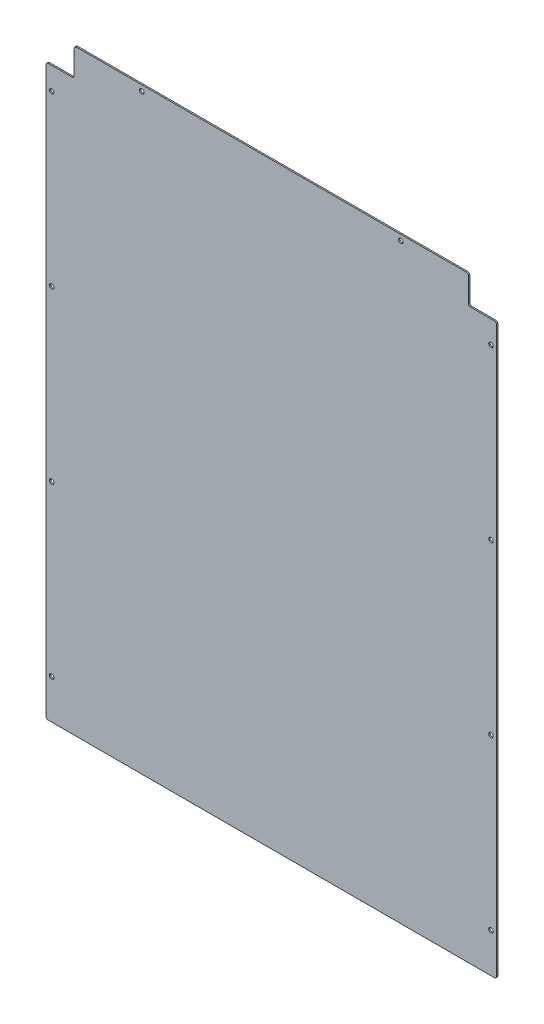
ISO-10303-21;
HEADER;
FILE_DESCRIPTION(('STEP AP214'),'2;1');
FILE_NAME('part.step','',(''),(''),'','','');
FILE_SCHEMA(('AUTOMOTIVE_DESIGN { 1 0 10303 214 1 1 1 1 }'));
ENDSEC;
DATA;
#1=APPLICATION_CONTEXT('core data for automotive mechanical design processes');
#2=APPLICATION_PROTOCOL_DEFINITION('international standard','automotive_design',2000,#1);
#3=PRODUCT_CONTEXT('',#1,'mechanical');
#4=PRODUCT('Part','Part','',(#3));
#5=PRODUCT_RELATED_PRODUCT_CATEGORY('part','',(#4));
#6=PRODUCT_DEFINITION_FORMATION('','',#4);
#7=PRODUCT_DEFINITION_CONTEXT('part definition',#1,'design');
#8=PRODUCT_DEFINITION('design','',#6,#7);
#9=PRODUCT_DEFINITION_SHAPE('','',#8);
#10=(LENGTH_UNIT() NAMED_UNIT(*) SI_UNIT(.MILLI.,.METRE.));
#11=(NAMED_UNIT(*) PLANE_ANGLE_UNIT() SI_UNIT($,.RADIAN.));
#12=(NAMED_UNIT(*) SI_UNIT($,.STERADIAN.) SOLID_ANGLE_UNIT());
#13=UNCERTAINTY_MEASURE_WITH_UNIT(LENGTH_MEASURE(1.E-05),#10,'distance_accuracy_value','');
#14=(GEOMETRIC_REPRESENTATION_CONTEXT(3) GLOBAL_UNCERTAINTY_ASSIGNED_CONTEXT((#13)) GLOBAL_UNIT_ASSIGNED_CONTEXT((#10,
#11,#12)) REPRESENTATION_CONTEXT('',''));
#15=CARTESIAN_POINT('',(0.,0.,0.));
#16=DIRECTION('',(0.,0.,1.));
#17=DIRECTION('',(1.,0.,0.));
#18=AXIS2_PLACEMENT_3D('',#15,#16,#17);
#19=CARTESIAN_POINT('',(-200.,0.,-1.2));
#20=DIRECTION('',(-1.,0.,0.));
#21=DIRECTION('',(0.,0.,1.));
#22=AXIS2_PLACEMENT_3D('',#19,#20,#21);
#23=PLANE('',#22);
#24=DIRECTION('',(0.,-1.,0.));
#25=VECTOR('',#24,1.);
#26=CARTESIAN_POINT('',(-200.,0.,-1.2));
#27=LINE('',#26,#25);
#28=CARTESIAN_POINT('',(-200.,503.,-1.2));
#29=VERTEX_POINT('',#28);
#30=CARTESIAN_POINT('',(-200.,2.,-1.2));
#31=VERTEX_POINT('',#30);
#32=EDGE_CURVE('E286',#29,#31,#27,.T.);
#33=ORIENTED_EDGE('',*,*,#32,.T.);
#34=DIRECTION('',(0.,0.,1.));
#35=VECTOR('',#34,1.);
#36=CARTESIAN_POINT('',(-200.,2.,-1.2));
#37=LINE('',#36,#35);
#38=CARTESIAN_POINT('',(-200.,2.,0.));
#39=VERTEX_POINT('',#38);
#40=EDGE_CURVE('E215',#31,#39,#37,.T.);
#41=ORIENTED_EDGE('',*,*,#40,.T.);
#42=DIRECTION('',(0.,-1.,0.));
#43=VECTOR('',#42,1.);
#44=CARTESIAN_POINT('',(-200.,0.,0.));
#45=LINE('',#44,#43);
#46=CARTESIAN_POINT('',(-200.,503.,0.));
#47=VERTEX_POINT('',#46);
#48=EDGE_CURVE('E158',#47,#39,#45,.T.);
#49=ORIENTED_EDGE('',*,*,#48,.F.);
#50=DIRECTION('',(0.,0.,1.));
#51=VECTOR('',#50,1.);
#52=CARTESIAN_POINT('',(-200.,503.,-1.2));
#53=LINE('',#52,#51);
#54=EDGE_CURVE('E213',#47,#29,#53,.F.);
#55=ORIENTED_EDGE('',*,*,#54,.T.);
#56=EDGE_LOOP('',(#33,#41,#49,#55));
#57=FACE_BOUND('',#56,.T.);
#58=ADVANCED_FACE('F40',(#57),#23,.T.);
#59=CARTESIAN_POINT('',(-200.,505.,-1.2));
#60=DIRECTION('',(0.,1.,0.));
#61=DIRECTION('',(0.,0.,1.));
#62=AXIS2_PLACEMENT_3D('',#59,#60,#61);
#63=PLANE('',#62);
#64=DIRECTION('',(-1.,0.,0.));
#65=VECTOR('',#64,1.);
#66=CARTESIAN_POINT('',(-200.,505.,-1.2));
#67=LINE('',#66,#65);
#68=CARTESIAN_POINT('',(-177.,505.,-1.2));
#69=VERTEX_POINT('',#68);
#70=CARTESIAN_POINT('',(-198.,505.,-1.2));
#71=VERTEX_POINT('',#70);
#72=EDGE_CURVE('E179',#69,#71,#67,.T.);
#73=ORIENTED_EDGE('',*,*,#72,.T.);
#74=DIRECTION('',(0.,0.,1.));
#75=VECTOR('',#74,1.);
#76=CARTESIAN_POINT('',(-198.,505.,-1.2));
#77=LINE('',#76,#75);
#78=CARTESIAN_POINT('',(-198.,505.,0.));
#79=VERTEX_POINT('',#78);
#80=EDGE_CURVE('E219',#71,#79,#77,.T.);
#81=ORIENTED_EDGE('',*,*,#80,.T.);
#82=DIRECTION('',(-1.,0.,0.));
#83=VECTOR('',#82,1.);
#84=CARTESIAN_POINT('',(-200.,505.,0.));
#85=LINE('',#84,#83);
#86=CARTESIAN_POINT('',(-177.,505.,0.));
#87=VERTEX_POINT('',#86);
#88=EDGE_CURVE('E187',#87,#79,#85,.T.);
#89=ORIENTED_EDGE('',*,*,#88,.F.);
#90=DIRECTION('',(0.,0.,1.));
#91=VECTOR('',#90,1.);
#92=CARTESIAN_POINT('',(-177.,505.,-1.2));
#93=LINE('',#92,#91);
#94=EDGE_CURVE('E217',#87,#69,#93,.F.);
#95=ORIENTED_EDGE('',*,*,#94,.T.);
#96=EDGE_LOOP('',(#73,#81,#89,#95));
#97=FACE_BOUND('',#96,.T.);
#98=ADVANCED_FACE('F378',(#97),#63,.T.);
#99=CARTESIAN_POINT('',(-175.,530.,-1.2));
#100=DIRECTION('',(-1.,0.,0.));
#101=DIRECTION('',(0.,-1.,0.));
#102=AXIS2_PLACEMENT_3D('',#99,#100,#101);
#103=PLANE('',#102);
#104=DIRECTION('',(0.,-1.,0.));
#105=VECTOR('',#104,1.);
#106=CARTESIAN_POINT('',(-175.,530.,-1.2));
#107=LINE('',#106,#105);
#108=CARTESIAN_POINT('',(-175.,528.,-1.2));
#109=VERTEX_POINT('',#108);
#110=CARTESIAN_POINT('',(-175.,507.,-1.2));
#111=VERTEX_POINT('',#110);
#112=EDGE_CURVE('E184',#109,#111,#107,.T.);
#113=ORIENTED_EDGE('',*,*,#112,.T.);
#114=DIRECTION('',(0.,0.,1.));
#115=VECTOR('',#114,1.);
#116=CARTESIAN_POINT('',(-175.,507.,0.));
#117=LINE('',#116,#115);
#118=CARTESIAN_POINT('',(-175.,507.,0.));
#119=VERTEX_POINT('',#118);
#120=EDGE_CURVE('E224',#111,#119,#117,.T.);
#121=ORIENTED_EDGE('',*,*,#120,.T.);
#122=DIRECTION('',(0.,-1.,0.));
#123=VECTOR('',#122,1.);
#124=CARTESIAN_POINT('',(-175.,530.,0.));
#125=LINE('',#124,#123);
#126=CARTESIAN_POINT('',(-175.,528.,0.));
#127=VERTEX_POINT('',#126);
#128=EDGE_CURVE('E282',#127,#119,#125,.T.);
#129=ORIENTED_EDGE('',*,*,#128,.F.);
#130=DIRECTION('',(0.,0.,1.));
#131=VECTOR('',#130,1.);
#132=CARTESIAN_POINT('',(-175.,528.,-1.2));
#133=LINE('',#132,#131);
#134=EDGE_CURVE('E222',#127,#109,#133,.F.);
#135=ORIENTED_EDGE('',*,*,#134,.T.);
#136=EDGE_LOOP('',(#113,#121,#129,#135));
#137=FACE_BOUND('',#136,.T.);
#138=ADVANCED_FACE('F383',(#137),#103,.T.);
#139=CARTESIAN_POINT('',(-175.,530.,-1.2));
#140=DIRECTION('',(0.,1.,0.));
#141=DIRECTION('',(0.,0.,1.));
#142=AXIS2_PLACEMENT_3D('',#139,#140,#141);
#143=PLANE('',#142);
#144=DIRECTION('',(-1.,0.,0.));
#145=VECTOR('',#144,1.);
#146=CARTESIAN_POINT('',(-175.,530.,-1.2));
#147=LINE('',#146,#145);
#148=CARTESIAN_POINT('',(173.,530.,-1.2));
#149=VERTEX_POINT('',#148);
#150=CARTESIAN_POINT('',(-173.,530.,-1.2));
#151=VERTEX_POINT('',#150);
#152=EDGE_CURVE('E265',#149,#151,#147,.T.);
#153=ORIENTED_EDGE('',*,*,#152,.T.);
#154=DIRECTION('',(0.,0.,1.));
#155=VECTOR('',#154,1.);
#156=CARTESIAN_POINT('',(-173.,530.,-1.2));
#157=LINE('',#156,#155);
#158=CARTESIAN_POINT('',(-173.,530.,0.));
#159=VERTEX_POINT('',#158);
#160=EDGE_CURVE('E229',#151,#159,#157,.T.);
#161=ORIENTED_EDGE('',*,*,#160,.T.);
#162=DIRECTION('',(-1.,0.,0.));
#163=VECTOR('',#162,1.);
#164=CARTESIAN_POINT('',(-175.,530.,0.));
#165=LINE('',#164,#163);
#166=CARTESIAN_POINT('',(173.,530.,0.));
#167=VERTEX_POINT('',#166);
#168=EDGE_CURVE('E256',#167,#159,#165,.T.);
#169=ORIENTED_EDGE('',*,*,#168,.F.);
#170=DIRECTION('',(0.,0.,1.));
#171=VECTOR('',#170,1.);
#172=CARTESIAN_POINT('',(173.,530.,-1.2));
#173=LINE('',#172,#171);
#174=EDGE_CURVE('E227',#167,#149,#173,.F.);
#175=ORIENTED_EDGE('',*,*,#174,.T.);
#176=EDGE_LOOP('',(#153,#161,#169,#175));
#177=FACE_BOUND('',#176,.T.);
#178=ADVANCED_FACE('F618',(#177),#143,.T.);
#179=CARTESIAN_POINT('',(175.,530.,-1.2));
#180=DIRECTION('',(1.,0.,0.));
#181=DIRECTION('',(0.,1.,0.));
#182=AXIS2_PLACEMENT_3D('',#179,#180,#181);
#183=PLANE('',#182);
#184=DIRECTION('',(0.,1.,0.));
#185=VECTOR('',#184,1.);
#186=CARTESIAN_POINT('',(175.,530.,-1.2));
#187=LINE('',#186,#185);
#188=CARTESIAN_POINT('',(175.,507.,-1.2));
#189=VERTEX_POINT('',#188);
#190=CARTESIAN_POINT('',(175.,528.,-1.2));
#191=VERTEX_POINT('',#190);
#192=EDGE_CURVE('E262',#189,#191,#187,.T.);
#193=ORIENTED_EDGE('',*,*,#192,.T.);
#194=DIRECTION('',(0.,0.,1.));
#195=VECTOR('',#194,1.);
#196=CARTESIAN_POINT('',(175.,528.,-1.2));
#197=LINE('',#196,#195);
#198=CARTESIAN_POINT('',(175.,528.,0.));
#199=VERTEX_POINT('',#198);
#200=EDGE_CURVE('E234',#191,#199,#197,.T.);
#201=ORIENTED_EDGE('',*,*,#200,.T.);
#202=DIRECTION('',(0.,1.,0.));
#203=VECTOR('',#202,1.);
#204=CARTESIAN_POINT('',(175.,530.,0.));
#205=LINE('',#204,#203);
#206=CARTESIAN_POINT('',(175.,507.,0.));
#207=VERTEX_POINT('',#206);
#208=EDGE_CURVE('E247',#207,#199,#205,.T.);
#209=ORIENTED_EDGE('',*,*,#208,.F.);
#210=DIRECTION('',(0.,0.,1.));
#211=VECTOR('',#210,1.);
#212=CARTESIAN_POINT('',(175.,507.,-1.2));
#213=LINE('',#212,#211);
#214=EDGE_CURVE('E232',#207,#189,#213,.F.);
#215=ORIENTED_EDGE('',*,*,#214,.T.);
#216=EDGE_LOOP('',(#193,#201,#209,#215));
#217=FACE_BOUND('',#216,.T.);
#218=ADVANCED_FACE('F254',(#217),#183,.T.);
#219=CARTESIAN_POINT('',(200.,505.,-1.2));
#220=DIRECTION('',(0.,1.,0.));
#221=DIRECTION('',(0.,0.,1.));
#222=AXIS2_PLACEMENT_3D('',#219,#220,#221);
#223=PLANE('',#222);
#224=DIRECTION('',(-1.,0.,0.));
#225=VECTOR('',#224,1.);
#226=CARTESIAN_POINT('',(200.,505.,-1.2));
#227=LINE('',#226,#225);
#228=CARTESIAN_POINT('',(198.,505.,-1.2));
#229=VERTEX_POINT('',#228);
#230=CARTESIAN_POINT('',(177.,505.,-1.2));
#231=VERTEX_POINT('',#230);
#232=EDGE_CURVE('E260',#229,#231,#227,.T.);
#233=ORIENTED_EDGE('',*,*,#232,.T.);
#234=DIRECTION('',(0.,0.,1.));
#235=VECTOR('',#234,1.);
#236=CARTESIAN_POINT('',(177.,505.,0.));
#237=LINE('',#236,#235);
#238=CARTESIAN_POINT('',(177.,505.,0.));
#239=VERTEX_POINT('',#238);
#240=EDGE_CURVE('E238',#231,#239,#237,.T.);
#241=ORIENTED_EDGE('',*,*,#240,.T.);
#242=DIRECTION('',(-1.,0.,0.));
#243=VECTOR('',#242,1.);
#244=CARTESIAN_POINT('',(200.,505.,0.));
#245=LINE('',#244,#243);
#246=CARTESIAN_POINT('',(198.,505.,0.));
#247=VERTEX_POINT('',#246);
#248=EDGE_CURVE('E248',#247,#239,#245,.T.);
#249=ORIENTED_EDGE('',*,*,#248,.F.);
#250=DIRECTION('',(0.,0.,1.));
#251=VECTOR('',#250,1.);
#252=CARTESIAN_POINT('',(198.,505.,-1.2));
#253=LINE('',#252,#251);
#254=EDGE_CURVE('E60',#247,#229,#253,.F.);
#255=ORIENTED_EDGE('',*,*,#254,.T.);
#256=EDGE_LOOP('',(#233,#241,#249,#255));
#257=FACE_BOUND('',#256,.T.);
#258=ADVANCED_FACE('F259',(#257),#223,.T.);
#259=CARTESIAN_POINT('',(200.,0.,-1.2));
#260=DIRECTION('',(1.,0.,0.));
#261=DIRECTION('',(0.,0.,-1.));
#262=AXIS2_PLACEMENT_3D('',#259,#260,#261);
#263=PLANE('',#262);
#264=DIRECTION('',(0.,1.,0.));
#265=VECTOR('',#264,1.);
#266=CARTESIAN_POINT('',(200.,0.,0.));
#267=LINE('',#266,#265);
#268=CARTESIAN_POINT('',(200.,2.,0.));
#269=VERTEX_POINT('',#268);
#270=CARTESIAN_POINT('',(200.,503.,0.));
#271=VERTEX_POINT('',#270);
#272=EDGE_CURVE('E174',#269,#271,#267,.T.);
#273=ORIENTED_EDGE('',*,*,#272,.F.);
#274=DIRECTION('',(0.,0.,1.));
#275=VECTOR('',#274,1.);
#276=CARTESIAN_POINT('',(200.,2.,-1.2));
#277=LINE('',#276,#275);
#278=CARTESIAN_POINT('',(200.,2.,-1.2));
#279=VERTEX_POINT('',#278);
#280=EDGE_CURVE('E200',#269,#279,#277,.F.);
#281=ORIENTED_EDGE('',*,*,#280,.T.);
#282=DIRECTION('',(0.,1.,0.));
#283=VECTOR('',#282,1.);
#284=CARTESIAN_POINT('',(200.,0.,-1.2));
#285=LINE('',#284,#283);
#286=CARTESIAN_POINT('',(200.,503.,-1.2));
#287=VERTEX_POINT('',#286);
#288=EDGE_CURVE('E263',#279,#287,#285,.T.);
#289=ORIENTED_EDGE('',*,*,#288,.T.);
#290=DIRECTION('',(0.,0.,1.));
#291=VECTOR('',#290,1.);
#292=CARTESIAN_POINT('',(200.,503.,-1.2));
#293=LINE('',#292,#291);
#294=EDGE_CURVE('E197',#287,#271,#293,.T.);
#295=ORIENTED_EDGE('',*,*,#294,.T.);
#296=EDGE_LOOP('',(#273,#281,#289,#295));
#297=FACE_BOUND('',#296,.T.);
#298=ADVANCED_FACE('F594',(#297),#263,.T.);
#299=CARTESIAN_POINT('',(-200.,0.,-1.2));
#300=DIRECTION('',(0.,-1.,0.));
#301=DIRECTION('',(0.,0.,-1.));
#302=AXIS2_PLACEMENT_3D('',#299,#300,#301);
#303=PLANE('',#302);
#304=DIRECTION('',(1.,0.,0.));
#305=VECTOR('',#304,1.);
#306=CARTESIAN_POINT('',(-200.,0.,-1.2));
#307=LINE('',#306,#305);
#308=CARTESIAN_POINT('',(-198.,0.,-1.2));
#309=VERTEX_POINT('',#308);
#310=CARTESIAN_POINT('',(198.,0.,-1.2));
#311=VERTEX_POINT('',#310);
#312=EDGE_CURVE('E268',#309,#311,#307,.T.);
#313=ORIENTED_EDGE('',*,*,#312,.T.);
#314=DIRECTION('',(0.,0.,1.));
#315=VECTOR('',#314,1.);
#316=CARTESIAN_POINT('',(198.,0.,-1.2));
#317=LINE('',#316,#315);
#318=CARTESIAN_POINT('',(198.,0.,0.));
#319=VERTEX_POINT('',#318);
#320=EDGE_CURVE('E173',#311,#319,#317,.T.);
#321=ORIENTED_EDGE('',*,*,#320,.T.);
#322=DIRECTION('',(1.,0.,0.));
#323=VECTOR('',#322,1.);
#324=CARTESIAN_POINT('',(-200.,0.,0.));
#325=LINE('',#324,#323);
#326=CARTESIAN_POINT('',(-198.,0.,0.));
#327=VERTEX_POINT('',#326);
#328=EDGE_CURVE('E156',#327,#319,#325,.T.);
#329=ORIENTED_EDGE('',*,*,#328,.F.);
#330=DIRECTION('',(0.,0.,1.));
#331=VECTOR('',#330,1.);
#332=CARTESIAN_POINT('',(-198.,0.,-1.2));
#333=LINE('',#332,#331);
#334=EDGE_CURVE('E170',#327,#309,#333,.F.);
#335=ORIENTED_EDGE('',*,*,#334,.T.);
#336=EDGE_LOOP('',(#313,#321,#329,#335));
#337=FACE_BOUND('',#336,.T.);
#338=ADVANCED_FACE('F169',(#337),#303,.T.);
#339=CARTESIAN_POINT('',(0.,0.,-1.2));
#340=DIRECTION('',(0.,0.,-1.));
#341=DIRECTION('',(-1.,0.,0.));
#342=AXIS2_PLACEMENT_3D('',#339,#340,#341);
#343=PLANE('',#342);
#344=CARTESIAN_POINT('',(-115.,525.,-1.2));
#345=DIRECTION('',(0.,0.,-1.));
#346=DIRECTION('',(-1.,0.,0.));
#347=AXIS2_PLACEMENT_3D('',#344,#345,#346);
#348=CIRCLE('',#347,2.);
#349=CARTESIAN_POINT('',(-117.,525.,-1.2));
#350=VERTEX_POINT('',#349);
#351=EDGE_CURVE('E276',#350,#350,#348,.T.);
#352=ORIENTED_EDGE('',*,*,#351,.F.);
#353=EDGE_LOOP('',(#352));
#354=FACE_BOUND('',#353,.T.);
#355=CARTESIAN_POINT('',(-195.,35.,-1.2));
#356=DIRECTION('',(0.,0.,-1.));
#357=DIRECTION('',(-1.,0.,0.));
#358=AXIS2_PLACEMENT_3D('',#355,#356,#357);
#359=CIRCLE('',#358,2.);
#360=CARTESIAN_POINT('',(-197.,35.,-1.2));
#361=VERTEX_POINT('',#360);
#362=EDGE_CURVE('E295',#361,#361,#359,.T.);
#363=ORIENTED_EDGE('',*,*,#362,.F.);
#364=EDGE_LOOP('',(#363));
#365=FACE_BOUND('',#364,.T.);
#366=CARTESIAN_POINT('',(-195.,185.,-1.2));
#367=DIRECTION('',(0.,0.,-1.));
#368=DIRECTION('',(-1.,0.,0.));
#369=AXIS2_PLACEMENT_3D('',#366,#367,#368);
#370=CIRCLE('',#369,2.);
#371=CARTESIAN_POINT('',(-197.,185.,-1.2));
#372=VERTEX_POINT('',#371);
#373=EDGE_CURVE('E298',#372,#372,#370,.T.);
#374=ORIENTED_EDGE('',*,*,#373,.F.);
#375=EDGE_LOOP('',(#374));
#376=FACE_BOUND('',#375,.T.);
#377=CARTESIAN_POINT('',(-195.,335.,-1.2));
#378=DIRECTION('',(0.,0.,-1.));
#379=DIRECTION('',(-1.,0.,0.));
#380=AXIS2_PLACEMENT_3D('',#377,#378,#379);
#381=CIRCLE('',#380,2.);
#382=CARTESIAN_POINT('',(-197.,335.,-1.2));
#383=VERTEX_POINT('',#382);
#384=EDGE_CURVE('E301',#383,#383,#381,.T.);
#385=ORIENTED_EDGE('',*,*,#384,.F.);
#386=EDGE_LOOP('',(#385));
#387=FACE_BOUND('',#386,.T.);
#388=CARTESIAN_POINT('',(195.,335.,-1.2));
#389=DIRECTION('',(0.,0.,-1.));
#390=DIRECTION('',(-1.,0.,0.));
#391=AXIS2_PLACEMENT_3D('',#388,#389,#390);
#392=CIRCLE('',#391,2.);
#393=CARTESIAN_POINT('',(193.,335.,-1.2));
#394=VERTEX_POINT('',#393);
#395=EDGE_CURVE('E304',#394,#394,#392,.T.);
#396=ORIENTED_EDGE('',*,*,#395,.F.);
#397=EDGE_LOOP('',(#396));
#398=FACE_BOUND('',#397,.T.);
#399=CARTESIAN_POINT('',(195.,185.,-1.2));
#400=DIRECTION('',(0.,0.,-1.));
#401=DIRECTION('',(-1.,0.,0.));
#402=AXIS2_PLACEMENT_3D('',#399,#400,#401);
#403=CIRCLE('',#402,2.);
#404=CARTESIAN_POINT('',(193.,185.,-1.2));
#405=VERTEX_POINT('',#404);
#406=EDGE_CURVE('E307',#405,#405,#403,.T.);
#407=ORIENTED_EDGE('',*,*,#406,.F.);
#408=EDGE_LOOP('',(#407));
#409=FACE_BOUND('',#408,.T.);
#410=CARTESIAN_POINT('',(195.,35.,-1.2));
#411=DIRECTION('',(0.,0.,-1.));
#412=DIRECTION('',(-1.,0.,0.));
#413=AXIS2_PLACEMENT_3D('',#410,#411,#412);
#414=CIRCLE('',#413,2.);
#415=CARTESIAN_POINT('',(193.,35.,-1.2));
#416=VERTEX_POINT('',#415);
#417=EDGE_CURVE('E310',#416,#416,#414,.T.);
#418=ORIENTED_EDGE('',*,*,#417,.F.);
#419=EDGE_LOOP('',(#418));
#420=FACE_BOUND('',#419,.T.);
#421=CARTESIAN_POINT('',(115.,525.,-1.2));
#422=DIRECTION('',(0.,0.,-1.));
#423=DIRECTION('',(-1.,0.,0.));
#424=AXIS2_PLACEMENT_3D('',#421,#422,#423);
#425=CIRCLE('',#424,2.);
#426=CARTESIAN_POINT('',(113.,525.,-1.2));
#427=VERTEX_POINT('',#426);
#428=EDGE_CURVE('E313',#427,#427,#425,.T.);
#429=ORIENTED_EDGE('',*,*,#428,.F.);
#430=EDGE_LOOP('',(#429));
#431=FACE_BOUND('',#430,.T.);
#432=CARTESIAN_POINT('',(195.,485.,-1.2));
#433=DIRECTION('',(0.,0.,-1.));
#434=DIRECTION('',(-1.,0.,0.));
#435=AXIS2_PLACEMENT_3D('',#432,#433,#434);
#436=CIRCLE('',#435,2.);
#437=CARTESIAN_POINT('',(193.,485.,-1.2));
#438=VERTEX_POINT('',#437);
#439=EDGE_CURVE('E316',#438,#438,#436,.T.);
#440=ORIENTED_EDGE('',*,*,#439,.F.);
#441=EDGE_LOOP('',(#440));
#442=FACE_BOUND('',#441,.T.);
#443=CARTESIAN_POINT('',(-195.,485.,-1.2));
#444=DIRECTION('',(0.,0.,-1.));
#445=DIRECTION('',(-1.,0.,0.));
#446=AXIS2_PLACEMENT_3D('',#443,#444,#445);
#447=CIRCLE('',#446,2.);
#448=CARTESIAN_POINT('',(-197.,485.,-1.2));
#449=VERTEX_POINT('',#448);
#450=EDGE_CURVE('E319',#449,#449,#447,.T.);
#451=ORIENTED_EDGE('',*,*,#450,.F.);
#452=EDGE_LOOP('',(#451));
#453=FACE_BOUND('',#452,.T.);
#454=ORIENTED_EDGE('',*,*,#288,.F.);
#455=CARTESIAN_POINT('',(198.,2.,-1.2));
#456=DIRECTION('',(0.,0.,-1.));
#457=DIRECTION('',(-1.,0.,0.));
#458=AXIS2_PLACEMENT_3D('',#455,#456,#457);
#459=CIRCLE('',#458,2.);
#460=EDGE_CURVE('E211',#279,#311,#459,.T.);
#461=ORIENTED_EDGE('',*,*,#460,.T.);
#462=ORIENTED_EDGE('',*,*,#312,.F.);
#463=CARTESIAN_POINT('',(-198.,2.,-1.2));
#464=DIRECTION('',(0.,0.,-1.));
#465=DIRECTION('',(-1.,0.,0.));
#466=AXIS2_PLACEMENT_3D('',#463,#464,#465);
#467=CIRCLE('',#466,2.);
#468=EDGE_CURVE('E178',#309,#31,#467,.T.);
#469=ORIENTED_EDGE('',*,*,#468,.T.);
#470=ORIENTED_EDGE('',*,*,#32,.F.);
#471=CARTESIAN_POINT('',(-198.,503.,-1.2));
#472=DIRECTION('',(0.,0.,-1.));
#473=DIRECTION('',(-1.,0.,0.));
#474=AXIS2_PLACEMENT_3D('',#471,#472,#473);
#475=CIRCLE('',#474,2.);
#476=EDGE_CURVE('E208',#29,#71,#475,.T.);
#477=ORIENTED_EDGE('',*,*,#476,.T.);
#478=ORIENTED_EDGE('',*,*,#72,.F.);
#479=CARTESIAN_POINT('',(-177.,507.,-1.2));
#480=DIRECTION('',(0.,0.,-1.));
#481=DIRECTION('',(-1.,0.,0.));
#482=AXIS2_PLACEMENT_3D('',#479,#480,#481);
#483=CIRCLE('',#482,2.);
#484=EDGE_CURVE('E243',#69,#111,#483,.F.);
#485=ORIENTED_EDGE('',*,*,#484,.T.);
#486=ORIENTED_EDGE('',*,*,#112,.F.);
#487=CARTESIAN_POINT('',(-173.,528.,-1.2));
#488=DIRECTION('',(0.,0.,-1.));
#489=DIRECTION('',(-1.,0.,0.));
#490=AXIS2_PLACEMENT_3D('',#487,#488,#489);
#491=CIRCLE('',#490,2.);
#492=EDGE_CURVE('E206',#109,#151,#491,.T.);
#493=ORIENTED_EDGE('',*,*,#492,.T.);
#494=ORIENTED_EDGE('',*,*,#152,.F.);
#495=CARTESIAN_POINT('',(173.,528.,-1.2));
#496=DIRECTION('',(0.,0.,-1.));
#497=DIRECTION('',(-1.,0.,0.));
#498=AXIS2_PLACEMENT_3D('',#495,#496,#497);
#499=CIRCLE('',#498,2.);
#500=EDGE_CURVE('E204',#149,#191,#499,.T.);
#501=ORIENTED_EDGE('',*,*,#500,.T.);
#502=ORIENTED_EDGE('',*,*,#192,.F.);
#503=CARTESIAN_POINT('',(177.,507.,-1.2));
#504=DIRECTION('',(0.,0.,-1.));
#505=DIRECTION('',(-1.,0.,0.));
#506=AXIS2_PLACEMENT_3D('',#503,#504,#505);
#507=CIRCLE('',#506,2.);
#508=EDGE_CURVE('E11',#189,#231,#507,.F.);
#509=ORIENTED_EDGE('',*,*,#508,.T.);
#510=ORIENTED_EDGE('',*,*,#232,.F.);
#511=CARTESIAN_POINT('',(198.,503.,-1.2));
#512=DIRECTION('',(0.,0.,-1.));
#513=DIRECTION('',(-1.,0.,0.));
#514=AXIS2_PLACEMENT_3D('',#511,#512,#513);
#515=CIRCLE('',#514,2.);
#516=EDGE_CURVE('E202',#229,#287,#515,.T.);
#517=ORIENTED_EDGE('',*,*,#516,.T.);
#518=EDGE_LOOP('',(#454,#461,#462,#469,#470,#477,#478,#485,#486,#493,#494,#501,#502,#509,#510,#517));
#519=FACE_BOUND('',#518,.T.);
#520=ADVANCED_FACE('F358',(#354,#365,#376,#387,#398,#409,#420,#431,#442,#453,#519),#343,.T.);
#521=CARTESIAN_POINT('',(0.,0.,0.));
#522=DIRECTION('',(0.,0.,-1.));
#523=DIRECTION('',(-1.,0.,0.));
#524=AXIS2_PLACEMENT_3D('',#521,#522,#523);
#525=PLANE('',#524);
#526=CARTESIAN_POINT('',(-115.,525.,0.));
#527=DIRECTION('',(0.,0.,1.));
#528=DIRECTION('',(1.,0.,0.));
#529=AXIS2_PLACEMENT_3D('',#526,#527,#528);
#530=CIRCLE('',#529,2.);
#531=CARTESIAN_POINT('',(-113.,525.,0.));
#532=VERTEX_POINT('',#531);
#533=EDGE_CURVE('E333',#532,#532,#530,.T.);
#534=ORIENTED_EDGE('',*,*,#533,.F.);
#535=EDGE_LOOP('',(#534));
#536=FACE_BOUND('',#535,.T.);
#537=CARTESIAN_POINT('',(-195.,35.,0.));
#538=DIRECTION('',(0.,0.,1.));
#539=DIRECTION('',(1.,0.,0.));
#540=AXIS2_PLACEMENT_3D('',#537,#538,#539);
#541=CIRCLE('',#540,2.);
#542=CARTESIAN_POINT('',(-193.,35.,0.));
#543=VERTEX_POINT('',#542);
#544=EDGE_CURVE('E343',#543,#543,#541,.T.);
#545=ORIENTED_EDGE('',*,*,#544,.F.);
#546=EDGE_LOOP('',(#545));
#547=FACE_BOUND('',#546,.T.);
#548=CARTESIAN_POINT('',(-195.,185.,0.));
#549=DIRECTION('',(0.,0.,1.));
#550=DIRECTION('',(1.,0.,0.));
#551=AXIS2_PLACEMENT_3D('',#548,#549,#550);
#552=CIRCLE('',#551,2.);
#553=CARTESIAN_POINT('',(-193.,185.,0.));
#554=VERTEX_POINT('',#553);
#555=EDGE_CURVE('E340',#554,#554,#552,.T.);
#556=ORIENTED_EDGE('',*,*,#555,.F.);
#557=EDGE_LOOP('',(#556));
#558=FACE_BOUND('',#557,.T.);
#559=CARTESIAN_POINT('',(-195.,335.,0.));
#560=DIRECTION('',(0.,0.,1.));
#561=DIRECTION('',(1.,0.,0.));
#562=AXIS2_PLACEMENT_3D('',#559,#560,#561);
#563=CIRCLE('',#562,2.);
#564=CARTESIAN_POINT('',(-193.,335.,0.));
#565=VERTEX_POINT('',#564);
#566=EDGE_CURVE('E325',#565,#565,#563,.T.);
#567=ORIENTED_EDGE('',*,*,#566,.F.);
#568=EDGE_LOOP('',(#567));
#569=FACE_BOUND('',#568,.T.);
#570=CARTESIAN_POINT('',(195.,335.,0.));
#571=DIRECTION('',(0.,0.,1.));
#572=DIRECTION('',(-1.,0.,0.));
#573=AXIS2_PLACEMENT_3D('',#570,#571,#572);
#574=CIRCLE('',#573,2.);
#575=CARTESIAN_POINT('',(193.,335.,0.));
#576=VERTEX_POINT('',#575);
#577=EDGE_CURVE('E334',#576,#576,#574,.T.);
#578=ORIENTED_EDGE('',*,*,#577,.F.);
#579=EDGE_LOOP('',(#578));
#580=FACE_BOUND('',#579,.T.);
#581=CARTESIAN_POINT('',(195.,185.,0.));
#582=DIRECTION('',(0.,0.,1.));
#583=DIRECTION('',(-1.,0.,0.));
#584=AXIS2_PLACEMENT_3D('',#581,#582,#583);
#585=CIRCLE('',#584,2.);
#586=CARTESIAN_POINT('',(193.,185.,0.));
#587=VERTEX_POINT('',#586);
#588=EDGE_CURVE('E330',#587,#587,#585,.T.);
#589=ORIENTED_EDGE('',*,*,#588,.F.);
#590=EDGE_LOOP('',(#589));
#591=FACE_BOUND('',#590,.T.);
#592=CARTESIAN_POINT('',(195.,35.,0.));
#593=DIRECTION('',(0.,0.,1.));
#594=DIRECTION('',(-1.,0.,0.));
#595=AXIS2_PLACEMENT_3D('',#592,#593,#594);
#596=CIRCLE('',#595,2.);
#597=CARTESIAN_POINT('',(193.,35.,0.));
#598=VERTEX_POINT('',#597);
#599=EDGE_CURVE('E326',#598,#598,#596,.T.);
#600=ORIENTED_EDGE('',*,*,#599,.F.);
#601=EDGE_LOOP('',(#600));
#602=FACE_BOUND('',#601,.T.);
#603=CARTESIAN_POINT('',(115.,525.,0.));
#604=DIRECTION('',(0.,0.,1.));
#605=DIRECTION('',(-1.,0.,0.));
#606=AXIS2_PLACEMENT_3D('',#603,#604,#605);
#607=CIRCLE('',#606,2.);
#608=CARTESIAN_POINT('',(113.,525.,0.));
#609=VERTEX_POINT('',#608);
#610=EDGE_CURVE('E329',#609,#609,#607,.T.);
#611=ORIENTED_EDGE('',*,*,#610,.F.);
#612=EDGE_LOOP('',(#611));
#613=FACE_BOUND('',#612,.T.);
#614=CARTESIAN_POINT('',(195.,485.,0.));
#615=DIRECTION('',(0.,0.,1.));
#616=DIRECTION('',(-1.,0.,0.));
#617=AXIS2_PLACEMENT_3D('',#614,#615,#616);
#618=CIRCLE('',#617,2.);
#619=CARTESIAN_POINT('',(193.,485.,0.));
#620=VERTEX_POINT('',#619);
#621=EDGE_CURVE('E337',#620,#620,#618,.T.);
#622=ORIENTED_EDGE('',*,*,#621,.F.);
#623=EDGE_LOOP('',(#622));
#624=FACE_BOUND('',#623,.T.);
#625=CARTESIAN_POINT('',(-195.,485.,0.));
#626=DIRECTION('',(0.,0.,1.));
#627=DIRECTION('',(1.,0.,0.));
#628=AXIS2_PLACEMENT_3D('',#625,#626,#627);
#629=CIRCLE('',#628,2.);
#630=CARTESIAN_POINT('',(-193.,485.,0.));
#631=VERTEX_POINT('',#630);
#632=EDGE_CURVE('E322',#631,#631,#629,.T.);
#633=ORIENTED_EDGE('',*,*,#632,.F.);
#634=EDGE_LOOP('',(#633));
#635=FACE_BOUND('',#634,.T.);
#636=ORIENTED_EDGE('',*,*,#328,.T.);
#637=CARTESIAN_POINT('',(198.,2.,0.));
#638=DIRECTION('',(0.,0.,-1.));
#639=DIRECTION('',(-1.,0.,0.));
#640=AXIS2_PLACEMENT_3D('',#637,#638,#639);
#641=CIRCLE('',#640,2.);
#642=EDGE_CURVE('E163',#319,#269,#641,.F.);
#643=ORIENTED_EDGE('',*,*,#642,.T.);
#644=ORIENTED_EDGE('',*,*,#272,.T.);
#645=CARTESIAN_POINT('',(198.,503.,0.));
#646=DIRECTION('',(0.,0.,-1.));
#647=DIRECTION('',(-1.,0.,0.));
#648=AXIS2_PLACEMENT_3D('',#645,#646,#647);
#649=CIRCLE('',#648,2.);
#650=EDGE_CURVE('E181',#271,#247,#649,.F.);
#651=ORIENTED_EDGE('',*,*,#650,.T.);
#652=ORIENTED_EDGE('',*,*,#248,.T.);
#653=CARTESIAN_POINT('',(177.,507.,0.));
#654=DIRECTION('',(0.,0.,-1.));
#655=DIRECTION('',(-1.,0.,0.));
#656=AXIS2_PLACEMENT_3D('',#653,#654,#655);
#657=CIRCLE('',#656,2.);
#658=EDGE_CURVE('E48',#239,#207,#657,.T.);
#659=ORIENTED_EDGE('',*,*,#658,.T.);
#660=ORIENTED_EDGE('',*,*,#208,.T.);
#661=CARTESIAN_POINT('',(173.,528.,0.));
#662=DIRECTION('',(0.,0.,-1.));
#663=DIRECTION('',(-1.,0.,0.));
#664=AXIS2_PLACEMENT_3D('',#661,#662,#663);
#665=CIRCLE('',#664,2.);
#666=EDGE_CURVE('E191',#199,#167,#665,.F.);
#667=ORIENTED_EDGE('',*,*,#666,.T.);
#668=ORIENTED_EDGE('',*,*,#168,.T.);
#669=CARTESIAN_POINT('',(-173.,528.,0.));
#670=DIRECTION('',(0.,0.,-1.));
#671=DIRECTION('',(-1.,0.,0.));
#672=AXIS2_PLACEMENT_3D('',#669,#670,#671);
#673=CIRCLE('',#672,2.);
#674=EDGE_CURVE('E193',#159,#127,#673,.F.);
#675=ORIENTED_EDGE('',*,*,#674,.T.);
#676=ORIENTED_EDGE('',*,*,#128,.T.);
#677=CARTESIAN_POINT('',(-177.,507.,0.));
#678=DIRECTION('',(0.,0.,-1.));
#679=DIRECTION('',(-1.,0.,0.));
#680=AXIS2_PLACEMENT_3D('',#677,#678,#679);
#681=CIRCLE('',#680,2.);
#682=EDGE_CURVE('E241',#119,#87,#681,.T.);
#683=ORIENTED_EDGE('',*,*,#682,.T.);
#684=ORIENTED_EDGE('',*,*,#88,.T.);
#685=CARTESIAN_POINT('',(-198.,503.,0.));
#686=DIRECTION('',(0.,0.,-1.));
#687=DIRECTION('',(-1.,0.,0.));
#688=AXIS2_PLACEMENT_3D('',#685,#686,#687);
#689=CIRCLE('',#688,2.);
#690=EDGE_CURVE('E164',#79,#47,#689,.F.);
#691=ORIENTED_EDGE('',*,*,#690,.T.);
#692=ORIENTED_EDGE('',*,*,#48,.T.);
#693=CARTESIAN_POINT('',(-198.,2.,0.));
#694=DIRECTION('',(0.,0.,-1.));
#695=DIRECTION('',(-1.,0.,0.));
#696=AXIS2_PLACEMENT_3D('',#693,#694,#695);
#697=CIRCLE('',#696,2.);
#698=EDGE_CURVE('E153',#39,#327,#697,.F.);
#699=ORIENTED_EDGE('',*,*,#698,.T.);
#700=EDGE_LOOP('',(#636,#643,#644,#651,#652,#659,#660,#667,#668,#675,#676,#683,#684,#691,#692,#699));
#701=FACE_BOUND('',#700,.T.);
#702=ADVANCED_FACE('F155',(#536,#547,#558,#569,#580,#591,#602,#613,#624,#635,#701),#525,.F.);
#703=CARTESIAN_POINT('',(198.,2.,-1.2));
#704=DIRECTION('',(0.,0.,1.));
#705=DIRECTION('',(1.,0.,0.));
#706=AXIS2_PLACEMENT_3D('',#703,#704,#705);
#707=CYLINDRICAL_SURFACE('',#706,2.);
#708=ORIENTED_EDGE('',*,*,#460,.F.);
#709=ORIENTED_EDGE('',*,*,#280,.F.);
#710=ORIENTED_EDGE('',*,*,#642,.F.);
#711=ORIENTED_EDGE('',*,*,#320,.F.);
#712=EDGE_LOOP('',(#708,#709,#710,#711));
#713=FACE_BOUND('',#712,.T.);
#714=ADVANCED_FACE('F357',(#713),#707,.T.);
#715=CARTESIAN_POINT('',(-198.,2.,-1.2));
#716=DIRECTION('',(0.,0.,1.));
#717=DIRECTION('',(1.,0.,0.));
#718=AXIS2_PLACEMENT_3D('',#715,#716,#717);
#719=CYLINDRICAL_SURFACE('',#718,2.);
#720=ORIENTED_EDGE('',*,*,#468,.F.);
#721=ORIENTED_EDGE('',*,*,#334,.F.);
#722=ORIENTED_EDGE('',*,*,#698,.F.);
#723=ORIENTED_EDGE('',*,*,#40,.F.);
#724=EDGE_LOOP('',(#720,#721,#722,#723));
#725=FACE_BOUND('',#724,.T.);
#726=ADVANCED_FACE('F177',(#725),#719,.T.);
#727=CARTESIAN_POINT('',(-198.,503.,-1.2));
#728=DIRECTION('',(0.,0.,1.));
#729=DIRECTION('',(1.,0.,0.));
#730=AXIS2_PLACEMENT_3D('',#727,#728,#729);
#731=CYLINDRICAL_SURFACE('',#730,2.);
#732=ORIENTED_EDGE('',*,*,#476,.F.);
#733=ORIENTED_EDGE('',*,*,#54,.F.);
#734=ORIENTED_EDGE('',*,*,#690,.F.);
#735=ORIENTED_EDGE('',*,*,#80,.F.);
#736=EDGE_LOOP('',(#732,#733,#734,#735));
#737=FACE_BOUND('',#736,.T.);
#738=ADVANCED_FACE('F394',(#737),#731,.T.);
#739=CARTESIAN_POINT('',(-177.,507.,-1.2));
#740=DIRECTION('',(0.,0.,-1.));
#741=DIRECTION('',(-1.,0.,0.));
#742=AXIS2_PLACEMENT_3D('',#739,#740,#741);
#743=CYLINDRICAL_SURFACE('',#742,2.);
#744=ORIENTED_EDGE('',*,*,#484,.F.);
#745=ORIENTED_EDGE('',*,*,#94,.F.);
#746=ORIENTED_EDGE('',*,*,#682,.F.);
#747=ORIENTED_EDGE('',*,*,#120,.F.);
#748=EDGE_LOOP('',(#744,#745,#746,#747));
#749=FACE_BOUND('',#748,.T.);
#750=ADVANCED_FACE('F397',(#749),#743,.F.);
#751=CARTESIAN_POINT('',(-173.,528.,-1.2));
#752=DIRECTION('',(0.,0.,1.));
#753=DIRECTION('',(1.,0.,0.));
#754=AXIS2_PLACEMENT_3D('',#751,#752,#753);
#755=CYLINDRICAL_SURFACE('',#754,2.);
#756=ORIENTED_EDGE('',*,*,#492,.F.);
#757=ORIENTED_EDGE('',*,*,#134,.F.);
#758=ORIENTED_EDGE('',*,*,#674,.F.);
#759=ORIENTED_EDGE('',*,*,#160,.F.);
#760=EDGE_LOOP('',(#756,#757,#758,#759));
#761=FACE_BOUND('',#760,.T.);
#762=ADVANCED_FACE('F401',(#761),#755,.T.);
#763=CARTESIAN_POINT('',(173.,528.,-1.2));
#764=DIRECTION('',(0.,0.,1.));
#765=DIRECTION('',(1.,0.,0.));
#766=AXIS2_PLACEMENT_3D('',#763,#764,#765);
#767=CYLINDRICAL_SURFACE('',#766,2.);
#768=ORIENTED_EDGE('',*,*,#500,.F.);
#769=ORIENTED_EDGE('',*,*,#174,.F.);
#770=ORIENTED_EDGE('',*,*,#666,.F.);
#771=ORIENTED_EDGE('',*,*,#200,.F.);
#772=EDGE_LOOP('',(#768,#769,#770,#771));
#773=FACE_BOUND('',#772,.T.);
#774=ADVANCED_FACE('F405',(#773),#767,.T.);
#775=CARTESIAN_POINT('',(177.,507.,-1.2));
#776=DIRECTION('',(0.,0.,-1.));
#777=DIRECTION('',(-1.,0.,0.));
#778=AXIS2_PLACEMENT_3D('',#775,#776,#777);
#779=CYLINDRICAL_SURFACE('',#778,2.);
#780=ORIENTED_EDGE('',*,*,#508,.F.);
#781=ORIENTED_EDGE('',*,*,#214,.F.);
#782=ORIENTED_EDGE('',*,*,#658,.F.);
#783=ORIENTED_EDGE('',*,*,#240,.F.);
#784=EDGE_LOOP('',(#780,#781,#782,#783));
#785=FACE_BOUND('',#784,.T.);
#786=ADVANCED_FACE('F258',(#785),#779,.F.);
#787=CARTESIAN_POINT('',(198.,503.,-1.2));
#788=DIRECTION('',(0.,0.,1.));
#789=DIRECTION('',(1.,0.,0.));
#790=AXIS2_PLACEMENT_3D('',#787,#788,#789);
#791=CYLINDRICAL_SURFACE('',#790,2.);
#792=ORIENTED_EDGE('',*,*,#516,.F.);
#793=ORIENTED_EDGE('',*,*,#254,.F.);
#794=ORIENTED_EDGE('',*,*,#650,.F.);
#795=ORIENTED_EDGE('',*,*,#294,.F.);
#796=EDGE_LOOP('',(#792,#793,#794,#795));
#797=FACE_BOUND('',#796,.T.);
#798=ADVANCED_FACE('F42',(#797),#791,.T.);
#799=CARTESIAN_POINT('',(-195.,485.,-10.));
#800=DIRECTION('',(0.,0.,1.));
#801=DIRECTION('',(1.,0.,0.));
#802=AXIS2_PLACEMENT_3D('',#799,#800,#801);
#803=CYLINDRICAL_SURFACE('',#802,2.);
#804=ORIENTED_EDGE('',*,*,#450,.T.);
#805=EDGE_LOOP('',(#804));
#806=FACE_BOUND('',#805,.T.);
#807=ORIENTED_EDGE('',*,*,#632,.T.);
#808=EDGE_LOOP('',(#807));
#809=FACE_BOUND('',#808,.T.);
#810=ADVANCED_FACE('F363',(#806,#809),#803,.F.);
#811=CARTESIAN_POINT('',(195.,485.,-10.));
#812=DIRECTION('',(0.,0.,1.));
#813=DIRECTION('',(1.,0.,0.));
#814=AXIS2_PLACEMENT_3D('',#811,#812,#813);
#815=CYLINDRICAL_SURFACE('',#814,2.);
#816=ORIENTED_EDGE('',*,*,#439,.T.);
#817=EDGE_LOOP('',(#816));
#818=FACE_BOUND('',#817,.T.);
#819=ORIENTED_EDGE('',*,*,#621,.T.);
#820=EDGE_LOOP('',(#819));
#821=FACE_BOUND('',#820,.T.);
#822=ADVANCED_FACE('F353',(#818,#821),#815,.F.);
#823=CARTESIAN_POINT('',(115.,525.,-10.));
#824=DIRECTION('',(0.,0.,1.));
#825=DIRECTION('',(1.,0.,0.));
#826=AXIS2_PLACEMENT_3D('',#823,#824,#825);
#827=CYLINDRICAL_SURFACE('',#826,2.);
#828=ORIENTED_EDGE('',*,*,#428,.T.);
#829=EDGE_LOOP('',(#828));
#830=FACE_BOUND('',#829,.T.);
#831=ORIENTED_EDGE('',*,*,#610,.T.);
#832=EDGE_LOOP('',(#831));
#833=FACE_BOUND('',#832,.T.);
#834=ADVANCED_FACE('F371',(#830,#833),#827,.F.);
#835=CARTESIAN_POINT('',(195.,35.,-10.));
#836=DIRECTION('',(0.,0.,1.));
#837=DIRECTION('',(1.,0.,0.));
#838=AXIS2_PLACEMENT_3D('',#835,#836,#837);
#839=CYLINDRICAL_SURFACE('',#838,2.);
#840=ORIENTED_EDGE('',*,*,#417,.T.);
#841=EDGE_LOOP('',(#840));
#842=FACE_BOUND('',#841,.T.);
#843=ORIENTED_EDGE('',*,*,#599,.T.);
#844=EDGE_LOOP('',(#843));
#845=FACE_BOUND('',#844,.T.);
#846=ADVANCED_FACE('F451',(#842,#845),#839,.F.);
#847=CARTESIAN_POINT('',(195.,185.,-10.));
#848=DIRECTION('',(0.,0.,1.));
#849=DIRECTION('',(1.,0.,0.));
#850=AXIS2_PLACEMENT_3D('',#847,#848,#849);
#851=CYLINDRICAL_SURFACE('',#850,2.);
#852=ORIENTED_EDGE('',*,*,#406,.T.);
#853=EDGE_LOOP('',(#852));
#854=FACE_BOUND('',#853,.T.);
#855=ORIENTED_EDGE('',*,*,#588,.T.);
#856=EDGE_LOOP('',(#855));
#857=FACE_BOUND('',#856,.T.);
#858=ADVANCED_FACE('F462',(#854,#857),#851,.F.);
#859=CARTESIAN_POINT('',(195.,335.,-10.));
#860=DIRECTION('',(0.,0.,1.));
#861=DIRECTION('',(1.,0.,0.));
#862=AXIS2_PLACEMENT_3D('',#859,#860,#861);
#863=CYLINDRICAL_SURFACE('',#862,2.);
#864=ORIENTED_EDGE('',*,*,#395,.T.);
#865=EDGE_LOOP('',(#864));
#866=FACE_BOUND('',#865,.T.);
#867=ORIENTED_EDGE('',*,*,#577,.T.);
#868=EDGE_LOOP('',(#867));
#869=FACE_BOUND('',#868,.T.);
#870=ADVANCED_FACE('F472',(#866,#869),#863,.F.);
#871=CARTESIAN_POINT('',(-195.,335.,-10.));
#872=DIRECTION('',(0.,0.,1.));
#873=DIRECTION('',(1.,0.,0.));
#874=AXIS2_PLACEMENT_3D('',#871,#872,#873);
#875=CYLINDRICAL_SURFACE('',#874,2.);
#876=ORIENTED_EDGE('',*,*,#384,.T.);
#877=EDGE_LOOP('',(#876));
#878=FACE_BOUND('',#877,.T.);
#879=ORIENTED_EDGE('',*,*,#566,.T.);
#880=EDGE_LOOP('',(#879));
#881=FACE_BOUND('',#880,.T.);
#882=ADVANCED_FACE('F483',(#878,#881),#875,.F.);
#883=CARTESIAN_POINT('',(-195.,185.,-10.));
#884=DIRECTION('',(0.,0.,1.));
#885=DIRECTION('',(1.,0.,0.));
#886=AXIS2_PLACEMENT_3D('',#883,#884,#885);
#887=CYLINDRICAL_SURFACE('',#886,2.);
#888=ORIENTED_EDGE('',*,*,#373,.T.);
#889=EDGE_LOOP('',(#888));
#890=FACE_BOUND('',#889,.T.);
#891=ORIENTED_EDGE('',*,*,#555,.T.);
#892=EDGE_LOOP('',(#891));
#893=FACE_BOUND('',#892,.T.);
#894=ADVANCED_FACE('F494',(#890,#893),#887,.F.);
#895=CARTESIAN_POINT('',(-195.,35.,-10.));
#896=DIRECTION('',(0.,0.,1.));
#897=DIRECTION('',(1.,0.,0.));
#898=AXIS2_PLACEMENT_3D('',#895,#896,#897);
#899=CYLINDRICAL_SURFACE('',#898,2.);
#900=ORIENTED_EDGE('',*,*,#362,.T.);
#901=EDGE_LOOP('',(#900));
#902=FACE_BOUND('',#901,.T.);
#903=ORIENTED_EDGE('',*,*,#544,.T.);
#904=EDGE_LOOP('',(#903));
#905=FACE_BOUND('',#904,.T.);
#906=ADVANCED_FACE('F505',(#902,#905),#899,.F.);
#907=CARTESIAN_POINT('',(-115.,525.,-10.));
#908=DIRECTION('',(0.,0.,1.));
#909=DIRECTION('',(1.,0.,0.));
#910=AXIS2_PLACEMENT_3D('',#907,#908,#909);
#911=CYLINDRICAL_SURFACE('',#910,2.);
#912=ORIENTED_EDGE('',*,*,#351,.T.);
#913=EDGE_LOOP('',(#912));
#914=FACE_BOUND('',#913,.T.);
#915=ORIENTED_EDGE('',*,*,#533,.T.);
#916=EDGE_LOOP('',(#915));
#917=FACE_BOUND('',#916,.T.);
#918=ADVANCED_FACE('F516',(#914,#917),#911,.F.);
#919=CLOSED_SHELL('',(#58,#98,#138,#178,#218,#258,#298,#338,#520,#702,#714,#726,#738,#750,#762,
#774,#786,#798,#810,#822,#834,#846,#858,#870,#882,#894,#906,#918));
#920=MANIFOLD_SOLID_BREP('B2',#919);
#921=ADVANCED_BREP_SHAPE_REPRESENTATION('',(#18,#920),#14);
#922=SHAPE_DEFINITION_REPRESENTATION(#9,#921);
ENDSEC;
END-ISO-10303-21;
